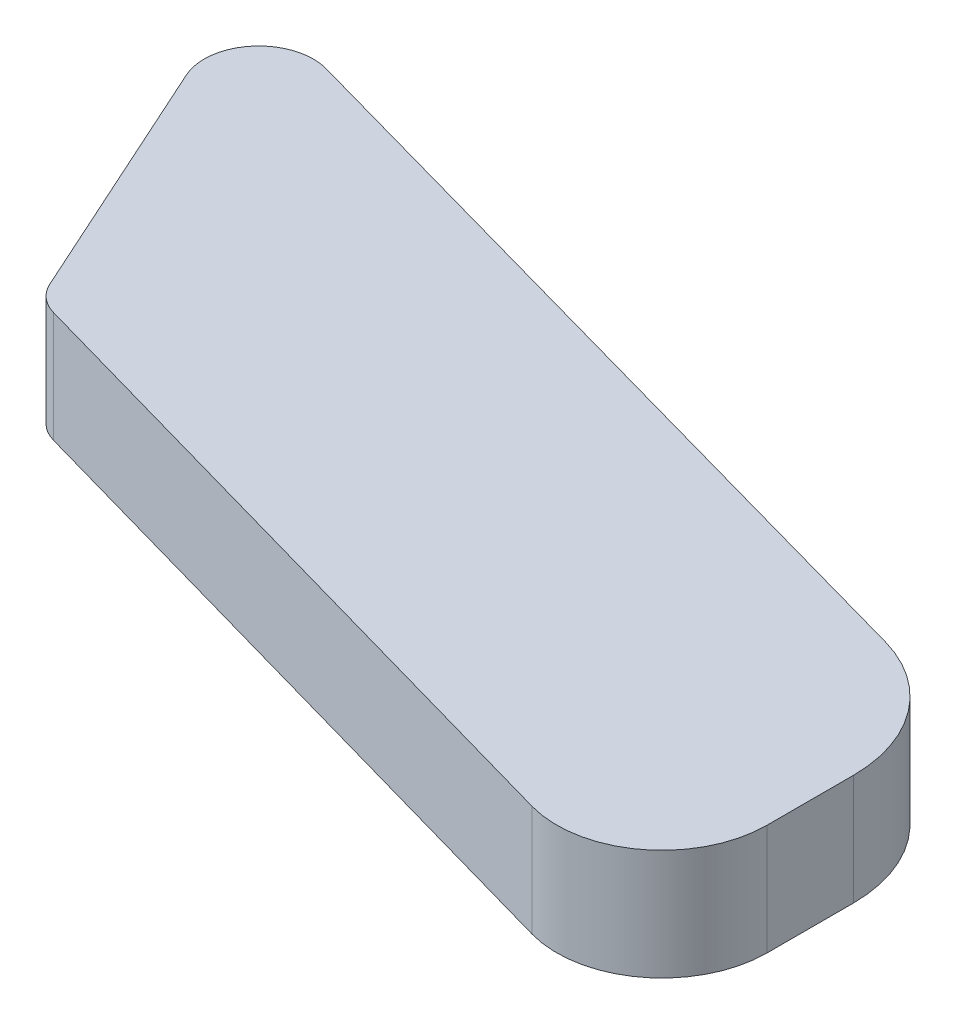
ISO-10303-21;
HEADER;
FILE_DESCRIPTION(('STEP AP214'),'2;1');
FILE_NAME('part.step','',(''),(''),'','','');
FILE_SCHEMA(('AUTOMOTIVE_DESIGN { 1 0 10303 214 1 1 1 1 }'));
ENDSEC;
DATA;
#1=APPLICATION_CONTEXT('core data for automotive mechanical design processes');
#2=APPLICATION_PROTOCOL_DEFINITION('international standard','automotive_design',2000,#1);
#3=PRODUCT_CONTEXT('',#1,'mechanical');
#4=PRODUCT('Part','Part','',(#3));
#5=PRODUCT_RELATED_PRODUCT_CATEGORY('part','',(#4));
#6=PRODUCT_DEFINITION_FORMATION('','',#4);
#7=PRODUCT_DEFINITION_CONTEXT('part definition',#1,'design');
#8=PRODUCT_DEFINITION('design','',#6,#7);
#9=PRODUCT_DEFINITION_SHAPE('','',#8);
#10=(LENGTH_UNIT() NAMED_UNIT(*) SI_UNIT(.MILLI.,.METRE.));
#11=(NAMED_UNIT(*) PLANE_ANGLE_UNIT() SI_UNIT($,.RADIAN.));
#12=(NAMED_UNIT(*) SI_UNIT($,.STERADIAN.) SOLID_ANGLE_UNIT());
#13=UNCERTAINTY_MEASURE_WITH_UNIT(LENGTH_MEASURE(1.E-05),#10,'distance_accuracy_value','');
#14=(GEOMETRIC_REPRESENTATION_CONTEXT(3) GLOBAL_UNCERTAINTY_ASSIGNED_CONTEXT((#13)) GLOBAL_UNIT_ASSIGNED_CONTEXT((#10,
#11,#12)) REPRESENTATION_CONTEXT('',''));
#15=CARTESIAN_POINT('',(0.,0.,0.));
#16=DIRECTION('',(0.,0.,1.));
#17=DIRECTION('',(1.,0.,0.));
#18=AXIS2_PLACEMENT_3D('',#15,#16,#17);
#19=CARTESIAN_POINT('',(-0.700101109612603,2.9906,4.6624744245396));
#20=DIRECTION('',(0.,-1.,0.));
#21=DIRECTION('',(-1.,0.,0.));
#22=AXIS2_PLACEMENT_3D('',#19,#20,#21);
#23=CYLINDRICAL_SURFACE('',#22,0.0296244305343106);
#24=CARTESIAN_POINT('',(-0.700101109612603,2.9906,4.6624744245396));
#25=DIRECTION('',(0.,1.,0.));
#26=DIRECTION('',(1.,0.,0.));
#27=AXIS2_PLACEMENT_3D('',#24,#25,#26);
#28=CIRCLE('',#27,0.0296244305343106);
#29=CARTESIAN_POINT('',(-0.729725540146914,2.9906,4.6624744245396));
#30=VERTEX_POINT('',#29);
#31=CARTESIAN_POINT('',(-0.727091401593187,2.9906,4.6746863458989));
#32=VERTEX_POINT('',#31);
#33=EDGE_CURVE('E11',#30,#32,#28,.T.);
#34=ORIENTED_EDGE('',*,*,#33,.F.);
#35=DIRECTION('',(0.,-1.,0.));
#36=VECTOR('',#35,1.);
#37=CARTESIAN_POINT('',(-0.729725540146914,2.9906,4.6624744245396));
#38=LINE('',#37,#36);
#39=CARTESIAN_POINT('',(-0.729725540146914,2.9306,4.6624744245396));
#40=VERTEX_POINT('',#39);
#41=EDGE_CURVE('E24',#30,#40,#38,.T.);
#42=ORIENTED_EDGE('',*,*,#41,.T.);
#43=CARTESIAN_POINT('',(-0.700101109612603,2.9306,4.6624744245396));
#44=DIRECTION('',(0.,1.,0.));
#45=DIRECTION('',(1.,0.,0.));
#46=AXIS2_PLACEMENT_3D('',#43,#44,#45);
#47=CIRCLE('',#46,0.0296244305343106);
#48=CARTESIAN_POINT('',(-0.727091401593187,2.9306,4.6746863458989));
#49=VERTEX_POINT('',#48);
#50=EDGE_CURVE('E157',#40,#49,#47,.T.);
#51=ORIENTED_EDGE('',*,*,#50,.T.);
#52=DIRECTION('',(0.,-1.,0.));
#53=VECTOR('',#52,1.);
#54=CARTESIAN_POINT('',(-0.727091401593187,2.9906,4.6746863458989));
#55=LINE('',#54,#53);
#56=EDGE_CURVE('E154',#32,#49,#55,.T.);
#57=ORIENTED_EDGE('',*,*,#56,.F.);
#58=EDGE_LOOP('',(#34,#42,#51,#57));
#59=FACE_BOUND('',#58,.T.);
#60=ADVANCED_FACE('F17',(#59),#23,.T.);
#61=CARTESIAN_POINT('',(-0.291431756941058,2.9906,4.8227567730168));
#62=DIRECTION('',(0.,-1.,0.));
#63=DIRECTION('',(-1.,0.,0.));
#64=AXIS2_PLACEMENT_3D('',#61,#62,#63);
#65=CYLINDRICAL_SURFACE('',#64,0.0740610763358077);
#66=CARTESIAN_POINT('',(-0.291431756941058,2.9306,4.8227567730168));
#67=DIRECTION('',(0.,1.,0.));
#68=DIRECTION('',(1.,0.,0.));
#69=AXIS2_PLACEMENT_3D('',#66,#67,#68);
#70=CIRCLE('',#69,0.0740610763358077);
#71=CARTESIAN_POINT('',(-0.21737068072653,2.9306,4.8227525346022));
#72=VERTEX_POINT('',#71);
#73=CARTESIAN_POINT('',(-0.271508401674307,2.9306,4.7514258334258));
#74=VERTEX_POINT('',#73);
#75=EDGE_CURVE('E152',#72,#74,#70,.T.);
#76=ORIENTED_EDGE('',*,*,#75,.T.);
#77=DIRECTION('',(0.,-1.,0.));
#78=VECTOR('',#77,1.);
#79=CARTESIAN_POINT('',(-0.271508401674307,2.9906,4.7514258334258));
#80=LINE('',#79,#78);
#81=CARTESIAN_POINT('',(-0.271508401674307,2.9906,4.7514258334258));
#82=VERTEX_POINT('',#81);
#83=EDGE_CURVE('E149',#82,#74,#80,.T.);
#84=ORIENTED_EDGE('',*,*,#83,.F.);
#85=CARTESIAN_POINT('',(-0.291431756941058,2.9906,4.8227567730168));
#86=DIRECTION('',(0.,1.,0.));
#87=DIRECTION('',(1.,0.,0.));
#88=AXIS2_PLACEMENT_3D('',#85,#86,#87);
#89=CIRCLE('',#88,0.0740610763358077);
#90=CARTESIAN_POINT('',(-0.21737068072653,2.9906,4.8227525346022));
#91=VERTEX_POINT('',#90);
#92=EDGE_CURVE('E147',#91,#82,#89,.T.);
#93=ORIENTED_EDGE('',*,*,#92,.F.);
#94=DIRECTION('',(0.,-1.,0.));
#95=VECTOR('',#94,1.);
#96=CARTESIAN_POINT('',(-0.21737068072653,2.9906,4.8227525346022));
#97=LINE('',#96,#95);
#98=EDGE_CURVE('E109',#91,#72,#97,.T.);
#99=ORIENTED_EDGE('',*,*,#98,.T.);
#100=EDGE_LOOP('',(#76,#84,#93,#99));
#101=FACE_BOUND('',#100,.T.);
#102=ADVANCED_FACE('F172',(#101),#65,.T.);
#103=CARTESIAN_POINT('',(-0.271508401674307,2.9906,4.7514258334258));
#104=DIRECTION('',(-0.269012499581201,0.,0.96313668555874));
#105=DIRECTION('',(0.96313668555874,0.,0.269012499581201));
#106=AXIS2_PLACEMENT_3D('',#103,#104,#105);
#107=PLANE('',#106);
#108=DIRECTION('',(-0.96313668555874,0.,-0.269012499581201));
#109=VECTOR('',#108,1.);
#110=CARTESIAN_POINT('',(-0.271508401674307,2.9306,4.7514258334258));
#111=LINE('',#110,#109);
#112=CARTESIAN_POINT('',(-0.692131767505909,2.9306,4.6339420487032));
#113=VERTEX_POINT('',#112);
#114=EDGE_CURVE('E144',#74,#113,#111,.T.);
#115=ORIENTED_EDGE('',*,*,#114,.T.);
#116=DIRECTION('',(0.,-1.,0.));
#117=VECTOR('',#116,1.);
#118=CARTESIAN_POINT('',(-0.692131767505909,2.9906,4.6339420487032));
#119=LINE('',#118,#117);
#120=CARTESIAN_POINT('',(-0.692131767505909,2.9906,4.6339420487032));
#121=VERTEX_POINT('',#120);
#122=EDGE_CURVE('E141',#121,#113,#119,.T.);
#123=ORIENTED_EDGE('',*,*,#122,.F.);
#124=DIRECTION('',(-0.96313668555874,0.,-0.269012499581201));
#125=VECTOR('',#124,1.);
#126=CARTESIAN_POINT('',(-0.271508401674307,2.9906,4.7514258334258));
#127=LINE('',#126,#125);
#128=EDGE_CURVE('E138',#82,#121,#127,.T.);
#129=ORIENTED_EDGE('',*,*,#128,.F.);
#130=ORIENTED_EDGE('',*,*,#83,.T.);
#131=EDGE_LOOP('',(#115,#123,#129,#130));
#132=FACE_BOUND('',#131,.T.);
#133=ADVANCED_FACE('F170',(#132),#107,.F.);
#134=CARTESIAN_POINT('',(-0.700101109612603,2.9906,4.6624744245396));
#135=DIRECTION('',(0.,-1.,0.));
#136=DIRECTION('',(-1.,0.,0.));
#137=AXIS2_PLACEMENT_3D('',#134,#135,#136);
#138=CYLINDRICAL_SURFACE('',#137,0.0296244305343106);
#139=ORIENTED_EDGE('',*,*,#41,.F.);
#140=CARTESIAN_POINT('',(-0.700101109612603,2.9906,4.6624744245396));
#141=DIRECTION('',(0.,1.,0.));
#142=DIRECTION('',(1.,0.,0.));
#143=AXIS2_PLACEMENT_3D('',#140,#141,#142);
#144=CIRCLE('',#143,0.0296244305343106);
#145=EDGE_CURVE('E136',#121,#30,#144,.T.);
#146=ORIENTED_EDGE('',*,*,#145,.F.);
#147=ORIENTED_EDGE('',*,*,#122,.T.);
#148=CARTESIAN_POINT('',(-0.700101109612603,2.9306,4.6624744245396));
#149=DIRECTION('',(0.,1.,0.));
#150=DIRECTION('',(1.,0.,0.));
#151=AXIS2_PLACEMENT_3D('',#148,#149,#150);
#152=CIRCLE('',#151,0.0296244305343106);
#153=EDGE_CURVE('E133',#113,#40,#152,.T.);
#154=ORIENTED_EDGE('',*,*,#153,.T.);
#155=EDGE_LOOP('',(#139,#146,#147,#154));
#156=FACE_BOUND('',#155,.T.);
#157=ADVANCED_FACE('F167',(#156),#138,.T.);
#158=CARTESIAN_POINT('',(-0.727091401593187,2.9906,4.6746863458989));
#159=DIRECTION('',(0.911082221456567,0.,-0.41222467871995));
#160=DIRECTION('',(-0.41222467871995,0.,-0.911082221456567));
#161=AXIS2_PLACEMENT_3D('',#158,#159,#160);
#162=PLANE('',#161);
#163=DIRECTION('',(0.41222467871995,0.,0.911082221456567));
#164=VECTOR('',#163,1.);
#165=CARTESIAN_POINT('',(-0.727091401593187,2.9306,4.6746863458989));
#166=LINE('',#165,#164);
#167=CARTESIAN_POINT('',(-0.665825313626354,2.9306,4.8100941620881));
#168=VERTEX_POINT('',#167);
#169=EDGE_CURVE('E131',#49,#168,#166,.T.);
#170=ORIENTED_EDGE('',*,*,#169,.T.);
#171=DIRECTION('',(0.,-1.,0.));
#172=VECTOR('',#171,1.);
#173=CARTESIAN_POINT('',(-0.665825313626354,2.9906,4.8100941620881));
#174=LINE('',#173,#172);
#175=CARTESIAN_POINT('',(-0.665825313626354,2.9906,4.8100941620881));
#176=VERTEX_POINT('',#175);
#177=EDGE_CURVE('E128',#176,#168,#174,.T.);
#178=ORIENTED_EDGE('',*,*,#177,.F.);
#179=DIRECTION('',(0.41222467871995,0.,0.911082221456567));
#180=VECTOR('',#179,1.);
#181=CARTESIAN_POINT('',(-0.727091401593187,2.9906,4.6746863458989));
#182=LINE('',#181,#180);
#183=EDGE_CURVE('E126',#32,#176,#182,.T.);
#184=ORIENTED_EDGE('',*,*,#183,.F.);
#185=ORIENTED_EDGE('',*,*,#56,.T.);
#186=EDGE_LOOP('',(#170,#178,#184,#185));
#187=FACE_BOUND('',#186,.T.);
#188=ADVANCED_FACE('F181',(#187),#162,.F.);
#189=CARTESIAN_POINT('',(-0.645582594640945,2.9906,4.8009352210686));
#190=DIRECTION('',(0.,-1.,0.));
#191=DIRECTION('',(-1.,0.,0.));
#192=AXIS2_PLACEMENT_3D('',#189,#190,#191);
#193=CYLINDRICAL_SURFACE('',#192,0.0222183229007084);
#194=CARTESIAN_POINT('',(-0.645582594640945,2.9306,4.8009352210686));
#195=DIRECTION('',(0.,1.,0.));
#196=DIRECTION('',(1.,0.,0.));
#197=AXIS2_PLACEMENT_3D('',#194,#195,#196);
#198=CIRCLE('',#197,0.0222183229007084);
#199=CARTESIAN_POINT('',(-0.651621544469577,2.9306,4.8223171049306));
#200=VERTEX_POINT('',#199);
#201=EDGE_CURVE('E124',#168,#200,#198,.T.);
#202=ORIENTED_EDGE('',*,*,#201,.T.);
#203=DIRECTION('',(0.,-1.,0.));
#204=VECTOR('',#203,1.);
#205=CARTESIAN_POINT('',(-0.651621544469577,2.9906,4.8223171049306));
#206=LINE('',#205,#204);
#207=CARTESIAN_POINT('',(-0.651621544469577,2.9906,4.8223171049306));
#208=VERTEX_POINT('',#207);
#209=EDGE_CURVE('E121',#208,#200,#206,.T.);
#210=ORIENTED_EDGE('',*,*,#209,.F.);
#211=CARTESIAN_POINT('',(-0.645582594640945,2.9906,4.8009352210686));
#212=DIRECTION('',(0.,1.,0.));
#213=DIRECTION('',(1.,0.,0.));
#214=AXIS2_PLACEMENT_3D('',#211,#212,#213);
#215=CIRCLE('',#214,0.0222183229007084);
#216=EDGE_CURVE('E119',#176,#208,#215,.T.);
#217=ORIENTED_EDGE('',*,*,#216,.F.);
#218=ORIENTED_EDGE('',*,*,#177,.T.);
#219=EDGE_LOOP('',(#202,#210,#217,#218));
#220=FACE_BOUND('',#219,.T.);
#221=ADVANCED_FACE('F178',(#220),#193,.T.);
#222=CARTESIAN_POINT('',(-0.651621544469577,2.9906,4.8223171049306));
#223=DIRECTION('',(0.271800434966908,0.,-0.962353637470031));
#224=DIRECTION('',(-0.962353637470031,0.,-0.271800434966908));
#225=AXIS2_PLACEMENT_3D('',#222,#223,#224);
#226=PLANE('',#225);
#227=DIRECTION('',(0.962353637470031,0.,0.271800434966908));
#228=VECTOR('',#227,1.);
#229=CARTESIAN_POINT('',(-0.651621544469577,2.9306,4.8223171049306));
#230=LINE('',#229,#228);
#231=CARTESIAN_POINT('',(-0.289894999782774,2.9306,4.9244806219132));
#232=VERTEX_POINT('',#231);
#233=EDGE_CURVE('E117',#200,#232,#230,.T.);
#234=ORIENTED_EDGE('',*,*,#233,.T.);
#235=DIRECTION('',(0.,-1.,0.));
#236=VECTOR('',#235,1.);
#237=CARTESIAN_POINT('',(-0.289894999782774,2.9906,4.9244806219132));
#238=LINE('',#237,#236);
#239=CARTESIAN_POINT('',(-0.289894999782774,2.9906,4.9244806219132));
#240=VERTEX_POINT('',#239);
#241=EDGE_CURVE('E115',#240,#232,#238,.T.);
#242=ORIENTED_EDGE('',*,*,#241,.F.);
#243=DIRECTION('',(0.962353637470031,0.,0.271800434966908));
#244=VECTOR('',#243,1.);
#245=CARTESIAN_POINT('',(-0.651621544469577,2.9906,4.8223171049306));
#246=LINE('',#245,#244);
#247=EDGE_CURVE('E103',#208,#240,#246,.T.);
#248=ORIENTED_EDGE('',*,*,#247,.F.);
#249=ORIENTED_EDGE('',*,*,#209,.T.);
#250=EDGE_LOOP('',(#234,#242,#248,#249));
#251=FACE_BOUND('',#250,.T.);
#252=ADVANCED_FACE('F175',(#251),#226,.F.);
#253=CARTESIAN_POINT('',(-0.274395028555896,2.9906,4.8696004533341));
#254=DIRECTION('',(0.,-1.,0.));
#255=DIRECTION('',(-1.,0.,0.));
#256=AXIS2_PLACEMENT_3D('',#253,#254,#255);
#257=CYLINDRICAL_SURFACE('',#256,0.0570270287785531);
#258=CARTESIAN_POINT('',(-0.274395028555896,2.9306,4.8696004533341));
#259=DIRECTION('',(0.,1.,0.));
#260=DIRECTION('',(1.,0.,0.));
#261=AXIS2_PLACEMENT_3D('',#258,#259,#260);
#262=CIRCLE('',#261,0.0570270287785531);
#263=CARTESIAN_POINT('',(-0.217367999870729,2.9306,4.8695971897549));
#264=VERTEX_POINT('',#263);
#265=EDGE_CURVE('E90',#232,#264,#262,.T.);
#266=ORIENTED_EDGE('',*,*,#265,.T.);
#267=DIRECTION('',(0.,-1.,0.));
#268=VECTOR('',#267,1.);
#269=CARTESIAN_POINT('',(-0.217367999870729,2.9906,4.8695971897549));
#270=LINE('',#269,#268);
#271=CARTESIAN_POINT('',(-0.217367999870729,2.9906,4.8695971897549));
#272=VERTEX_POINT('',#271);
#273=EDGE_CURVE('E84',#272,#264,#270,.T.);
#274=ORIENTED_EDGE('',*,*,#273,.F.);
#275=CARTESIAN_POINT('',(-0.274395028555896,2.9906,4.8696004533341));
#276=DIRECTION('',(0.,1.,0.));
#277=DIRECTION('',(1.,0.,0.));
#278=AXIS2_PLACEMENT_3D('',#275,#276,#277);
#279=CIRCLE('',#278,0.0570270287785531);
#280=EDGE_CURVE('E88',#240,#272,#279,.T.);
#281=ORIENTED_EDGE('',*,*,#280,.F.);
#282=ORIENTED_EDGE('',*,*,#241,.T.);
#283=EDGE_LOOP('',(#266,#274,#281,#282));
#284=FACE_BOUND('',#283,.T.);
#285=ADVANCED_FACE('F86',(#284),#257,.T.);
#286=CARTESIAN_POINT('',(-0.217367999870729,2.9906,4.8695971897549));
#287=DIRECTION('',(-0.999999998362442,0.,5.72286376773195E-05));
#288=DIRECTION('',(5.72286376773195E-05,0.,0.999999998362442));
#289=AXIS2_PLACEMENT_3D('',#286,#287,#288);
#290=PLANE('',#289);
#291=DIRECTION('',(-5.72286376773195E-05,0.,-0.999999998362441));
#292=VECTOR('',#291,1.);
#293=CARTESIAN_POINT('',(-0.217367999870729,2.9306,4.8695971897549));
#294=LINE('',#293,#292);
#295=EDGE_CURVE('E104',#264,#72,#294,.T.);
#296=ORIENTED_EDGE('',*,*,#295,.T.);
#297=ORIENTED_EDGE('',*,*,#98,.F.);
#298=DIRECTION('',(-5.72286376773195E-05,0.,-0.999999998362441));
#299=VECTOR('',#298,1.);
#300=CARTESIAN_POINT('',(-0.217367999870729,2.9906,4.8695971897549));
#301=LINE('',#300,#299);
#302=EDGE_CURVE('E100',#272,#91,#301,.T.);
#303=ORIENTED_EDGE('',*,*,#302,.F.);
#304=ORIENTED_EDGE('',*,*,#273,.T.);
#305=EDGE_LOOP('',(#296,#297,#303,#304));
#306=FACE_BOUND('',#305,.T.);
#307=ADVANCED_FACE('F107',(#306),#290,.F.);
#308=CARTESIAN_POINT('',(-0.291431756941058,2.9906,4.8227567730168));
#309=DIRECTION('',(0.,1.,0.));
#310=DIRECTION('',(1.,0.,0.));
#311=AXIS2_PLACEMENT_3D('',#308,#309,#310);
#312=PLANE('',#311);
#313=ORIENTED_EDGE('',*,*,#92,.T.);
#314=ORIENTED_EDGE('',*,*,#128,.T.);
#315=ORIENTED_EDGE('',*,*,#145,.T.);
#316=ORIENTED_EDGE('',*,*,#33,.T.);
#317=ORIENTED_EDGE('',*,*,#183,.T.);
#318=ORIENTED_EDGE('',*,*,#216,.T.);
#319=ORIENTED_EDGE('',*,*,#247,.T.);
#320=ORIENTED_EDGE('',*,*,#280,.T.);
#321=ORIENTED_EDGE('',*,*,#302,.T.);
#322=EDGE_LOOP('',(#313,#314,#315,#316,#317,#318,#319,#320,#321));
#323=FACE_BOUND('',#322,.T.);
#324=ADVANCED_FACE('F99',(#323),#312,.T.);
#325=CARTESIAN_POINT('',(-0.291431756941058,2.9306,4.8227567730168));
#326=DIRECTION('',(0.,1.,0.));
#327=DIRECTION('',(1.,0.,0.));
#328=AXIS2_PLACEMENT_3D('',#325,#326,#327);
#329=PLANE('',#328);
#330=ORIENTED_EDGE('',*,*,#75,.F.);
#331=ORIENTED_EDGE('',*,*,#295,.F.);
#332=ORIENTED_EDGE('',*,*,#265,.F.);
#333=ORIENTED_EDGE('',*,*,#233,.F.);
#334=ORIENTED_EDGE('',*,*,#201,.F.);
#335=ORIENTED_EDGE('',*,*,#169,.F.);
#336=ORIENTED_EDGE('',*,*,#50,.F.);
#337=ORIENTED_EDGE('',*,*,#153,.F.);
#338=ORIENTED_EDGE('',*,*,#114,.F.);
#339=EDGE_LOOP('',(#330,#331,#332,#333,#334,#335,#336,#337,#338));
#340=FACE_BOUND('',#339,.T.);
#341=ADVANCED_FACE('F164',(#340),#329,.F.);
#342=CLOSED_SHELL('',(#60,#102,#133,#157,#188,#221,#252,#285,#307,#324,#341));
#343=MANIFOLD_SOLID_BREP('B1',#342);
#344=ADVANCED_BREP_SHAPE_REPRESENTATION('',(#18,#343),#14);
#345=SHAPE_DEFINITION_REPRESENTATION(#9,#344);
ENDSEC;
END-ISO-10303-21;
